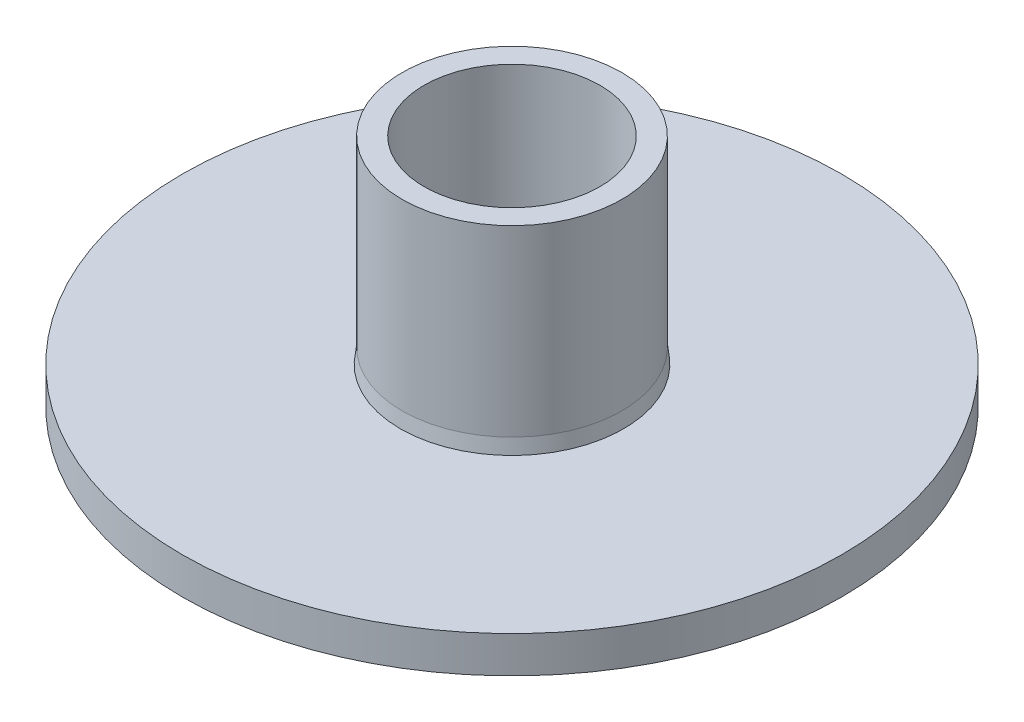
ISO-10303-21;
HEADER;
FILE_DESCRIPTION(('STEP AP214'),'2;1');
FILE_NAME('part.step','',(''),(''),'','','');
FILE_SCHEMA(('AUTOMOTIVE_DESIGN { 1 0 10303 214 1 1 1 1 }'));
ENDSEC;
DATA;
#1=APPLICATION_CONTEXT('core data for automotive mechanical design processes');
#2=APPLICATION_PROTOCOL_DEFINITION('international standard','automotive_design',2000,#1);
#3=PRODUCT_CONTEXT('',#1,'mechanical');
#4=PRODUCT('Part','Part','',(#3));
#5=PRODUCT_RELATED_PRODUCT_CATEGORY('part','',(#4));
#6=PRODUCT_DEFINITION_FORMATION('','',#4);
#7=PRODUCT_DEFINITION_CONTEXT('part definition',#1,'design');
#8=PRODUCT_DEFINITION('design','',#6,#7);
#9=PRODUCT_DEFINITION_SHAPE('','',#8);
#10=(LENGTH_UNIT() NAMED_UNIT(*) SI_UNIT(.MILLI.,.METRE.));
#11=(NAMED_UNIT(*) PLANE_ANGLE_UNIT() SI_UNIT($,.RADIAN.));
#12=(NAMED_UNIT(*) SI_UNIT($,.STERADIAN.) SOLID_ANGLE_UNIT());
#13=UNCERTAINTY_MEASURE_WITH_UNIT(LENGTH_MEASURE(1.E-05),#10,'distance_accuracy_value','');
#14=(GEOMETRIC_REPRESENTATION_CONTEXT(3) GLOBAL_UNCERTAINTY_ASSIGNED_CONTEXT((#13)) GLOBAL_UNIT_ASSIGNED_CONTEXT((#10,
#11,#12)) REPRESENTATION_CONTEXT('',''));
#15=CARTESIAN_POINT('',(0.,0.,0.));
#16=DIRECTION('',(0.,0.,1.));
#17=DIRECTION('',(1.,0.,0.));
#18=AXIS2_PLACEMENT_3D('',#15,#16,#17);
#19=CARTESIAN_POINT('',(0.,0.,0.));
#20=DIRECTION('',(0.,-1.,0.));
#21=DIRECTION('',(0.,0.,-1.));
#22=AXIS2_PLACEMENT_3D('',#19,#20,#21);
#23=CYLINDRICAL_SURFACE('',#22,45.);
#24=CARTESIAN_POINT('',(0.,4.99999999999999,0.));
#25=DIRECTION('',(0.,-1.,0.));
#26=DIRECTION('',(0.,0.,-1.));
#27=AXIS2_PLACEMENT_3D('',#24,#25,#26);
#28=CIRCLE('',#27,45.);
#29=CARTESIAN_POINT('',(0.,4.99999999999999,-45.));
#30=VERTEX_POINT('',#29);
#31=EDGE_CURVE('E116',#30,#30,#28,.T.);
#32=ORIENTED_EDGE('',*,*,#31,.T.);
#33=EDGE_LOOP('',(#32));
#34=FACE_BOUND('',#33,.T.);
#35=CARTESIAN_POINT('',(0.,0.,0.));
#36=DIRECTION('',(0.,-1.,0.));
#37=DIRECTION('',(0.,0.,-1.));
#38=AXIS2_PLACEMENT_3D('',#35,#36,#37);
#39=CIRCLE('',#38,45.);
#40=CARTESIAN_POINT('',(0.,0.,-45.));
#41=VERTEX_POINT('',#40);
#42=EDGE_CURVE('E77',#41,#41,#39,.T.);
#43=ORIENTED_EDGE('',*,*,#42,.F.);
#44=EDGE_LOOP('',(#43));
#45=FACE_BOUND('',#44,.T.);
#46=ADVANCED_FACE('F33',(#34,#45),#23,.T.);
#47=CARTESIAN_POINT('',(0.,0.,0.));
#48=DIRECTION('',(0.,-1.,0.));
#49=DIRECTION('',(0.,0.,-1.));
#50=AXIS2_PLACEMENT_3D('',#47,#48,#49);
#51=PLANE('',#50);
#52=ORIENTED_EDGE('',*,*,#42,.T.);
#53=EDGE_LOOP('',(#52));
#54=FACE_BOUND('',#53,.T.);
#55=CARTESIAN_POINT('',(0.,0.,0.));
#56=DIRECTION('',(0.,-1.,0.));
#57=DIRECTION('',(0.,0.,-1.));
#58=AXIS2_PLACEMENT_3D('',#55,#56,#57);
#59=CIRCLE('',#58,34.4);
#60=CARTESIAN_POINT('',(0.,0.,-34.4));
#61=VERTEX_POINT('',#60);
#62=EDGE_CURVE('E80',#61,#61,#59,.T.);
#63=ORIENTED_EDGE('',*,*,#62,.F.);
#64=EDGE_LOOP('',(#63));
#65=FACE_BOUND('',#64,.T.);
#66=ADVANCED_FACE('F139',(#54,#65),#51,.T.);
#67=CARTESIAN_POINT('',(0.,0.,0.));
#68=DIRECTION('',(0.,-1.,0.));
#69=DIRECTION('',(0.,0.,-1.));
#70=AXIS2_PLACEMENT_3D('',#67,#68,#69);
#71=CYLINDRICAL_SURFACE('',#70,34.4);
#72=CARTESIAN_POINT('',(0.,1.1,0.));
#73=DIRECTION('',(0.,1.,0.));
#74=DIRECTION('',(0.,0.,1.));
#75=AXIS2_PLACEMENT_3D('',#72,#73,#74);
#76=CIRCLE('',#75,34.4);
#77=CARTESIAN_POINT('',(0.,1.1,34.4));
#78=VERTEX_POINT('',#77);
#79=EDGE_CURVE('E40',#78,#78,#76,.T.);
#80=ORIENTED_EDGE('',*,*,#79,.T.);
#81=EDGE_LOOP('',(#80));
#82=FACE_BOUND('',#81,.T.);
#83=ORIENTED_EDGE('',*,*,#62,.T.);
#84=EDGE_LOOP('',(#83));
#85=FACE_BOUND('',#84,.T.);
#86=ADVANCED_FACE('F144',(#82,#85),#71,.F.);
#87=CARTESIAN_POINT('',(0.,1.3,0.));
#88=DIRECTION('',(0.,1.,0.));
#89=DIRECTION('',(0.,0.,1.));
#90=AXIS2_PLACEMENT_3D('',#87,#88,#89);
#91=PLANE('',#90);
#92=CARTESIAN_POINT('',(0.,1.3,0.));
#93=DIRECTION('',(0.,1.,0.));
#94=DIRECTION('',(0.,0.,1.));
#95=AXIS2_PLACEMENT_3D('',#92,#93,#94);
#96=CIRCLE('',#95,34.2);
#97=CARTESIAN_POINT('',(0.,1.3,34.2));
#98=VERTEX_POINT('',#97);
#99=EDGE_CURVE('E44',#98,#98,#96,.F.);
#100=ORIENTED_EDGE('',*,*,#99,.T.);
#101=EDGE_LOOP('',(#100));
#102=FACE_BOUND('',#101,.T.);
#103=CARTESIAN_POINT('',(0.,1.3,0.));
#104=DIRECTION('',(0.,1.,0.));
#105=DIRECTION('',(0.,0.,1.));
#106=AXIS2_PLACEMENT_3D('',#103,#104,#105);
#107=CIRCLE('',#106,32.2);
#108=CARTESIAN_POINT('',(0.,1.3,32.2));
#109=VERTEX_POINT('',#108);
#110=EDGE_CURVE('E48',#109,#109,#107,.T.);
#111=ORIENTED_EDGE('',*,*,#110,.T.);
#112=EDGE_LOOP('',(#111));
#113=FACE_BOUND('',#112,.T.);
#114=ADVANCED_FACE('F169',(#102,#113),#91,.F.);
#115=CARTESIAN_POINT('',(0.,0.,0.));
#116=DIRECTION('',(0.,-1.,0.));
#117=DIRECTION('',(0.,0.,-1.));
#118=AXIS2_PLACEMENT_3D('',#115,#116,#117);
#119=CYLINDRICAL_SURFACE('',#118,32.);
#120=CARTESIAN_POINT('',(0.,1.1,0.));
#121=DIRECTION('',(0.,1.,0.));
#122=DIRECTION('',(0.,0.,1.));
#123=AXIS2_PLACEMENT_3D('',#120,#121,#122);
#124=CIRCLE('',#123,32.);
#125=CARTESIAN_POINT('',(0.,1.1,32.));
#126=VERTEX_POINT('',#125);
#127=EDGE_CURVE('E10',#126,#126,#124,.F.);
#128=ORIENTED_EDGE('',*,*,#127,.T.);
#129=EDGE_LOOP('',(#128));
#130=FACE_BOUND('',#129,.T.);
#131=CARTESIAN_POINT('',(0.,0.,0.));
#132=DIRECTION('',(0.,-1.,0.));
#133=DIRECTION('',(0.,0.,-1.));
#134=AXIS2_PLACEMENT_3D('',#131,#132,#133);
#135=CIRCLE('',#134,32.);
#136=CARTESIAN_POINT('',(0.,0.,-32.));
#137=VERTEX_POINT('',#136);
#138=EDGE_CURVE('E83',#137,#137,#135,.T.);
#139=ORIENTED_EDGE('',*,*,#138,.F.);
#140=EDGE_LOOP('',(#139));
#141=FACE_BOUND('',#140,.T.);
#142=ADVANCED_FACE('F172',(#130,#141),#119,.T.);
#143=CARTESIAN_POINT('',(0.,0.,0.));
#144=DIRECTION('',(0.,-1.,0.));
#145=DIRECTION('',(0.,0.,-1.));
#146=AXIS2_PLACEMENT_3D('',#143,#144,#145);
#147=PLANE('',#146);
#148=ORIENTED_EDGE('',*,*,#138,.T.);
#149=EDGE_LOOP('',(#148));
#150=FACE_BOUND('',#149,.T.);
#151=CARTESIAN_POINT('',(0.,0.,0.));
#152=DIRECTION('',(0.,-1.,0.));
#153=DIRECTION('',(0.,0.,-1.));
#154=AXIS2_PLACEMENT_3D('',#151,#152,#153);
#155=CIRCLE('',#154,29.5);
#156=CARTESIAN_POINT('',(0.,0.,-29.5));
#157=VERTEX_POINT('',#156);
#158=EDGE_CURVE('E86',#157,#157,#155,.T.);
#159=ORIENTED_EDGE('',*,*,#158,.F.);
#160=EDGE_LOOP('',(#159));
#161=FACE_BOUND('',#160,.T.);
#162=ADVANCED_FACE('F180',(#150,#161),#147,.T.);
#163=CARTESIAN_POINT('',(0.,0.,0.));
#164=DIRECTION('',(0.,-1.,0.));
#165=DIRECTION('',(0.,0.,-1.));
#166=AXIS2_PLACEMENT_3D('',#163,#164,#165);
#167=CYLINDRICAL_SURFACE('',#166,29.5);
#168=CARTESIAN_POINT('',(0.,1.1,0.));
#169=DIRECTION('',(0.,1.,0.));
#170=DIRECTION('',(0.,0.,1.));
#171=AXIS2_PLACEMENT_3D('',#168,#169,#170);
#172=CIRCLE('',#171,29.5);
#173=CARTESIAN_POINT('',(0.,1.1,29.5));
#174=VERTEX_POINT('',#173);
#175=EDGE_CURVE('E56',#174,#174,#172,.T.);
#176=ORIENTED_EDGE('',*,*,#175,.T.);
#177=EDGE_LOOP('',(#176));
#178=FACE_BOUND('',#177,.T.);
#179=ORIENTED_EDGE('',*,*,#158,.T.);
#180=EDGE_LOOP('',(#179));
#181=FACE_BOUND('',#180,.T.);
#182=ADVANCED_FACE('F185',(#178,#181),#167,.F.);
#183=CARTESIAN_POINT('',(0.,1.3,0.));
#184=DIRECTION('',(0.,1.,0.));
#185=DIRECTION('',(0.,0.,1.));
#186=AXIS2_PLACEMENT_3D('',#183,#184,#185);
#187=PLANE('',#186);
#188=CARTESIAN_POINT('',(0.,1.3,0.));
#189=DIRECTION('',(0.,1.,0.));
#190=DIRECTION('',(0.,0.,1.));
#191=AXIS2_PLACEMENT_3D('',#188,#189,#190);
#192=CIRCLE('',#191,29.3);
#193=CARTESIAN_POINT('',(0.,1.3,29.3));
#194=VERTEX_POINT('',#193);
#195=EDGE_CURVE('E59',#194,#194,#192,.F.);
#196=ORIENTED_EDGE('',*,*,#195,.T.);
#197=EDGE_LOOP('',(#196));
#198=FACE_BOUND('',#197,.T.);
#199=CARTESIAN_POINT('',(0.,1.3,0.));
#200=DIRECTION('',(0.,1.,0.));
#201=DIRECTION('',(0.,0.,1.));
#202=AXIS2_PLACEMENT_3D('',#199,#200,#201);
#203=CIRCLE('',#202,27.3);
#204=CARTESIAN_POINT('',(0.,1.3,27.3));
#205=VERTEX_POINT('',#204);
#206=EDGE_CURVE('E62',#205,#205,#203,.T.);
#207=ORIENTED_EDGE('',*,*,#206,.T.);
#208=EDGE_LOOP('',(#207));
#209=FACE_BOUND('',#208,.T.);
#210=ADVANCED_FACE('F189',(#198,#209),#187,.F.);
#211=CARTESIAN_POINT('',(0.,0.,0.));
#212=DIRECTION('',(0.,-1.,0.));
#213=DIRECTION('',(0.,0.,-1.));
#214=AXIS2_PLACEMENT_3D('',#211,#212,#213);
#215=CYLINDRICAL_SURFACE('',#214,27.1);
#216=CARTESIAN_POINT('',(0.,1.1,0.));
#217=DIRECTION('',(0.,1.,0.));
#218=DIRECTION('',(0.,0.,1.));
#219=AXIS2_PLACEMENT_3D('',#216,#217,#218);
#220=CIRCLE('',#219,27.1);
#221=CARTESIAN_POINT('',(0.,1.1,27.1));
#222=VERTEX_POINT('',#221);
#223=EDGE_CURVE('E53',#222,#222,#220,.F.);
#224=ORIENTED_EDGE('',*,*,#223,.T.);
#225=EDGE_LOOP('',(#224));
#226=FACE_BOUND('',#225,.T.);
#227=CARTESIAN_POINT('',(0.,0.,0.));
#228=DIRECTION('',(0.,-1.,0.));
#229=DIRECTION('',(0.,0.,-1.));
#230=AXIS2_PLACEMENT_3D('',#227,#228,#229);
#231=CIRCLE('',#230,27.1);
#232=CARTESIAN_POINT('',(0.,0.,-27.1));
#233=VERTEX_POINT('',#232);
#234=EDGE_CURVE('E89',#233,#233,#231,.T.);
#235=ORIENTED_EDGE('',*,*,#234,.F.);
#236=EDGE_LOOP('',(#235));
#237=FACE_BOUND('',#236,.T.);
#238=ADVANCED_FACE('F193',(#226,#237),#215,.T.);
#239=CARTESIAN_POINT('',(0.,0.,0.));
#240=DIRECTION('',(0.,-1.,0.));
#241=DIRECTION('',(0.,0.,-1.));
#242=AXIS2_PLACEMENT_3D('',#239,#240,#241);
#243=PLANE('',#242);
#244=ORIENTED_EDGE('',*,*,#234,.T.);
#245=EDGE_LOOP('',(#244));
#246=FACE_BOUND('',#245,.T.);
#247=CARTESIAN_POINT('',(0.,0.,0.));
#248=DIRECTION('',(0.,-1.,0.));
#249=DIRECTION('',(0.,0.,-1.));
#250=AXIS2_PLACEMENT_3D('',#247,#248,#249);
#251=CIRCLE('',#250,18.4);
#252=CARTESIAN_POINT('',(0.,0.,-18.4));
#253=VERTEX_POINT('',#252);
#254=EDGE_CURVE('E92',#253,#253,#251,.T.);
#255=ORIENTED_EDGE('',*,*,#254,.F.);
#256=EDGE_LOOP('',(#255));
#257=FACE_BOUND('',#256,.T.);
#258=ADVANCED_FACE('F197',(#246,#257),#243,.T.);
#259=CARTESIAN_POINT('',(0.,0.,0.));
#260=DIRECTION('',(0.,-1.,0.));
#261=DIRECTION('',(0.,0.,-1.));
#262=AXIS2_PLACEMENT_3D('',#259,#260,#261);
#263=CYLINDRICAL_SURFACE('',#262,18.4);
#264=CARTESIAN_POINT('',(0.,1.1,0.));
#265=DIRECTION('',(0.,1.,0.));
#266=DIRECTION('',(0.,0.,1.));
#267=AXIS2_PLACEMENT_3D('',#264,#265,#266);
#268=CIRCLE('',#267,18.4);
#269=CARTESIAN_POINT('',(0.,1.1,18.4));
#270=VERTEX_POINT('',#269);
#271=EDGE_CURVE('E68',#270,#270,#268,.T.);
#272=ORIENTED_EDGE('',*,*,#271,.T.);
#273=EDGE_LOOP('',(#272));
#274=FACE_BOUND('',#273,.T.);
#275=ORIENTED_EDGE('',*,*,#254,.T.);
#276=EDGE_LOOP('',(#275));
#277=FACE_BOUND('',#276,.T.);
#278=ADVANCED_FACE('F201',(#274,#277),#263,.F.);
#279=CARTESIAN_POINT('',(0.,1.3,0.));
#280=DIRECTION('',(0.,1.,0.));
#281=DIRECTION('',(0.,0.,1.));
#282=AXIS2_PLACEMENT_3D('',#279,#280,#281);
#283=PLANE('',#282);
#284=CARTESIAN_POINT('',(0.,1.3,0.));
#285=DIRECTION('',(0.,1.,0.));
#286=DIRECTION('',(0.,0.,1.));
#287=AXIS2_PLACEMENT_3D('',#284,#285,#286);
#288=CIRCLE('',#287,18.2);
#289=CARTESIAN_POINT('',(0.,1.3,18.2));
#290=VERTEX_POINT('',#289);
#291=EDGE_CURVE('E71',#290,#290,#288,.F.);
#292=ORIENTED_EDGE('',*,*,#291,.T.);
#293=EDGE_LOOP('',(#292));
#294=FACE_BOUND('',#293,.T.);
#295=CARTESIAN_POINT('',(0.,1.3,0.));
#296=DIRECTION('',(0.,1.,0.));
#297=DIRECTION('',(0.,0.,1.));
#298=AXIS2_PLACEMENT_3D('',#295,#296,#297);
#299=CIRCLE('',#298,16.2);
#300=CARTESIAN_POINT('',(0.,1.3,16.2));
#301=VERTEX_POINT('',#300);
#302=EDGE_CURVE('E74',#301,#301,#299,.T.);
#303=ORIENTED_EDGE('',*,*,#302,.T.);
#304=EDGE_LOOP('',(#303));
#305=FACE_BOUND('',#304,.T.);
#306=ADVANCED_FACE('F205',(#294,#305),#283,.F.);
#307=CARTESIAN_POINT('',(0.,0.,0.));
#308=DIRECTION('',(0.,-1.,0.));
#309=DIRECTION('',(0.,0.,-1.));
#310=AXIS2_PLACEMENT_3D('',#307,#308,#309);
#311=CYLINDRICAL_SURFACE('',#310,16.);
#312=CARTESIAN_POINT('',(0.,1.1,0.));
#313=DIRECTION('',(0.,1.,0.));
#314=DIRECTION('',(0.,0.,1.));
#315=AXIS2_PLACEMENT_3D('',#312,#313,#314);
#316=CIRCLE('',#315,16.);
#317=CARTESIAN_POINT('',(0.,1.1,16.));
#318=VERTEX_POINT('',#317);
#319=EDGE_CURVE('E65',#318,#318,#316,.F.);
#320=ORIENTED_EDGE('',*,*,#319,.T.);
#321=EDGE_LOOP('',(#320));
#322=FACE_BOUND('',#321,.T.);
#323=CARTESIAN_POINT('',(0.,0.,0.));
#324=DIRECTION('',(0.,-1.,0.));
#325=DIRECTION('',(0.,0.,-1.));
#326=AXIS2_PLACEMENT_3D('',#323,#324,#325);
#327=CIRCLE('',#326,16.);
#328=CARTESIAN_POINT('',(0.,0.,-16.));
#329=VERTEX_POINT('',#328);
#330=EDGE_CURVE('E95',#329,#329,#327,.T.);
#331=ORIENTED_EDGE('',*,*,#330,.F.);
#332=EDGE_LOOP('',(#331));
#333=FACE_BOUND('',#332,.T.);
#334=ADVANCED_FACE('F209',(#322,#333),#311,.T.);
#335=CARTESIAN_POINT('',(0.,0.,0.));
#336=DIRECTION('',(0.,-1.,0.));
#337=DIRECTION('',(0.,0.,-1.));
#338=AXIS2_PLACEMENT_3D('',#335,#336,#337);
#339=PLANE('',#338);
#340=ORIENTED_EDGE('',*,*,#330,.T.);
#341=EDGE_LOOP('',(#340));
#342=FACE_BOUND('',#341,.T.);
#343=CARTESIAN_POINT('',(0.,0.,0.));
#344=DIRECTION('',(0.,-1.,0.));
#345=DIRECTION('',(0.,0.,-1.));
#346=AXIS2_PLACEMENT_3D('',#343,#344,#345);
#347=CIRCLE('',#346,13.);
#348=CARTESIAN_POINT('',(0.,0.,-13.));
#349=VERTEX_POINT('',#348);
#350=EDGE_CURVE('E98',#349,#349,#347,.T.);
#351=ORIENTED_EDGE('',*,*,#350,.F.);
#352=EDGE_LOOP('',(#351));
#353=FACE_BOUND('',#352,.T.);
#354=ADVANCED_FACE('F213',(#342,#353),#339,.T.);
#355=CARTESIAN_POINT('',(0.,8.5,0.));
#356=DIRECTION('',(0.,-1.,0.));
#357=DIRECTION('',(0.,0.,-1.));
#358=AXIS2_PLACEMENT_3D('',#355,#356,#357);
#359=CONICAL_SURFACE('',#358,12.,0.117108744566864);
#360=ORIENTED_EDGE('',*,*,#350,.T.);
#361=EDGE_LOOP('',(#360));
#362=FACE_BOUND('',#361,.T.);
#363=CARTESIAN_POINT('',(0.,8.5,0.));
#364=DIRECTION('',(0.,-1.,0.));
#365=DIRECTION('',(0.,0.,-1.));
#366=AXIS2_PLACEMENT_3D('',#363,#364,#365);
#367=CIRCLE('',#366,12.);
#368=CARTESIAN_POINT('',(0.,8.5,-12.));
#369=VERTEX_POINT('',#368);
#370=EDGE_CURVE('E101',#369,#369,#367,.T.);
#371=ORIENTED_EDGE('',*,*,#370,.F.);
#372=EDGE_LOOP('',(#371));
#373=FACE_BOUND('',#372,.T.);
#374=ADVANCED_FACE('F217',(#362,#373),#359,.F.);
#375=CARTESIAN_POINT('',(0.,0.,0.));
#376=DIRECTION('',(0.,-1.,0.));
#377=DIRECTION('',(0.,0.,-1.));
#378=AXIS2_PLACEMENT_3D('',#375,#376,#377);
#379=CYLINDRICAL_SURFACE('',#378,12.);
#380=ORIENTED_EDGE('',*,*,#370,.T.);
#381=EDGE_LOOP('',(#380));
#382=FACE_BOUND('',#381,.T.);
#383=CARTESIAN_POINT('',(0.,32.,0.));
#384=DIRECTION('',(0.,-1.,0.));
#385=DIRECTION('',(0.,0.,-1.));
#386=AXIS2_PLACEMENT_3D('',#383,#384,#385);
#387=CIRCLE('',#386,12.);
#388=CARTESIAN_POINT('',(0.,32.,-12.));
#389=VERTEX_POINT('',#388);
#390=EDGE_CURVE('E104',#389,#389,#387,.T.);
#391=ORIENTED_EDGE('',*,*,#390,.F.);
#392=EDGE_LOOP('',(#391));
#393=FACE_BOUND('',#392,.T.);
#394=ADVANCED_FACE('F221',(#382,#393),#379,.F.);
#395=CARTESIAN_POINT('',(0.,32.,0.));
#396=DIRECTION('',(0.,1.,0.));
#397=DIRECTION('',(0.,0.,1.));
#398=AXIS2_PLACEMENT_3D('',#395,#396,#397);
#399=PLANE('',#398);
#400=ORIENTED_EDGE('',*,*,#390,.T.);
#401=EDGE_LOOP('',(#400));
#402=FACE_BOUND('',#401,.T.);
#403=CARTESIAN_POINT('',(0.,32.,0.));
#404=DIRECTION('',(0.,-1.,0.));
#405=DIRECTION('',(0.,0.,-1.));
#406=AXIS2_PLACEMENT_3D('',#403,#404,#405);
#407=CIRCLE('',#406,15.);
#408=CARTESIAN_POINT('',(0.,32.,-15.));
#409=VERTEX_POINT('',#408);
#410=EDGE_CURVE('E107',#409,#409,#407,.T.);
#411=ORIENTED_EDGE('',*,*,#410,.F.);
#412=EDGE_LOOP('',(#411));
#413=FACE_BOUND('',#412,.T.);
#414=ADVANCED_FACE('F225',(#402,#413),#399,.T.);
#415=CARTESIAN_POINT('',(0.,0.,0.));
#416=DIRECTION('',(0.,-1.,0.));
#417=DIRECTION('',(0.,0.,-1.));
#418=AXIS2_PLACEMENT_3D('',#415,#416,#417);
#419=CYLINDRICAL_SURFACE('',#418,15.);
#420=ORIENTED_EDGE('',*,*,#410,.T.);
#421=EDGE_LOOP('',(#420));
#422=FACE_BOUND('',#421,.T.);
#423=CARTESIAN_POINT('',(0.,6.99999999999999,0.));
#424=DIRECTION('',(0.,-1.,0.));
#425=DIRECTION('',(0.,0.,-1.));
#426=AXIS2_PLACEMENT_3D('',#423,#424,#425);
#427=CIRCLE('',#426,15.);
#428=CARTESIAN_POINT('',(0.,6.99999999999999,-15.));
#429=VERTEX_POINT('',#428);
#430=EDGE_CURVE('E110',#429,#429,#427,.T.);
#431=ORIENTED_EDGE('',*,*,#430,.F.);
#432=EDGE_LOOP('',(#431));
#433=FACE_BOUND('',#432,.T.);
#434=ADVANCED_FACE('F135',(#422,#433),#419,.T.);
#435=CARTESIAN_POINT('',(0.,4.99999999999999,0.));
#436=DIRECTION('',(0.,-1.,0.));
#437=DIRECTION('',(0.,0.,-1.));
#438=AXIS2_PLACEMENT_3D('',#435,#436,#437);
#439=CONICAL_SURFACE('',#438,15.2352941176471,0.117108744566863);
#440=ORIENTED_EDGE('',*,*,#430,.T.);
#441=EDGE_LOOP('',(#440));
#442=FACE_BOUND('',#441,.T.);
#443=CARTESIAN_POINT('',(0.,4.99999999999999,0.));
#444=DIRECTION('',(0.,-1.,0.));
#445=DIRECTION('',(0.,0.,-1.));
#446=AXIS2_PLACEMENT_3D('',#443,#444,#445);
#447=CIRCLE('',#446,15.2352941176471);
#448=CARTESIAN_POINT('',(0.,4.99999999999999,-15.2352941176471));
#449=VERTEX_POINT('',#448);
#450=EDGE_CURVE('E113',#449,#449,#447,.T.);
#451=ORIENTED_EDGE('',*,*,#450,.F.);
#452=EDGE_LOOP('',(#451));
#453=FACE_BOUND('',#452,.T.);
#454=ADVANCED_FACE('F125',(#442,#453),#439,.T.);
#455=CARTESIAN_POINT('',(0.,4.99999999999999,0.));
#456=DIRECTION('',(0.,1.,0.));
#457=DIRECTION('',(0.,0.,1.));
#458=AXIS2_PLACEMENT_3D('',#455,#456,#457);
#459=PLANE('',#458);
#460=ORIENTED_EDGE('',*,*,#450,.T.);
#461=EDGE_LOOP('',(#460));
#462=FACE_BOUND('',#461,.T.);
#463=ORIENTED_EDGE('',*,*,#31,.F.);
#464=EDGE_LOOP('',(#463));
#465=FACE_BOUND('',#464,.T.);
#466=ADVANCED_FACE('F122',(#462,#465),#459,.T.);
#467=CARTESIAN_POINT('',(0.,1.1,0.));
#468=DIRECTION('',(0.,1.,0.));
#469=DIRECTION('',(0.,0.,1.));
#470=AXIS2_PLACEMENT_3D('',#467,#468,#469);
#471=TOROIDAL_SURFACE('',#470,18.2,0.2);
#472=ORIENTED_EDGE('',*,*,#271,.F.);
#473=EDGE_LOOP('',(#472));
#474=FACE_BOUND('',#473,.T.);
#475=ORIENTED_EDGE('',*,*,#291,.F.);
#476=EDGE_LOOP('',(#475));
#477=FACE_BOUND('',#476,.T.);
#478=ADVANCED_FACE('F124',(#474,#477),#471,.F.);
#479=CARTESIAN_POINT('',(0.,1.1,0.));
#480=DIRECTION('',(0.,1.,0.));
#481=DIRECTION('',(0.,0.,1.));
#482=AXIS2_PLACEMENT_3D('',#479,#480,#481);
#483=TOROIDAL_SURFACE('',#482,16.2,0.2);
#484=ORIENTED_EDGE('',*,*,#302,.F.);
#485=EDGE_LOOP('',(#484));
#486=FACE_BOUND('',#485,.T.);
#487=ORIENTED_EDGE('',*,*,#319,.F.);
#488=EDGE_LOOP('',(#487));
#489=FACE_BOUND('',#488,.T.);
#490=ADVANCED_FACE('F132',(#486,#489),#483,.F.);
#491=CARTESIAN_POINT('',(0.,1.1,0.));
#492=DIRECTION('',(0.,1.,0.));
#493=DIRECTION('',(0.,0.,1.));
#494=AXIS2_PLACEMENT_3D('',#491,#492,#493);
#495=TOROIDAL_SURFACE('',#494,29.3,0.2);
#496=ORIENTED_EDGE('',*,*,#175,.F.);
#497=EDGE_LOOP('',(#496));
#498=FACE_BOUND('',#497,.T.);
#499=ORIENTED_EDGE('',*,*,#195,.F.);
#500=EDGE_LOOP('',(#499));
#501=FACE_BOUND('',#500,.T.);
#502=ADVANCED_FACE('F151',(#498,#501),#495,.F.);
#503=CARTESIAN_POINT('',(0.,1.1,0.));
#504=DIRECTION('',(0.,1.,0.));
#505=DIRECTION('',(0.,0.,1.));
#506=AXIS2_PLACEMENT_3D('',#503,#504,#505);
#507=TOROIDAL_SURFACE('',#506,27.3,0.2);
#508=ORIENTED_EDGE('',*,*,#206,.F.);
#509=EDGE_LOOP('',(#508));
#510=FACE_BOUND('',#509,.T.);
#511=ORIENTED_EDGE('',*,*,#223,.F.);
#512=EDGE_LOOP('',(#511));
#513=FACE_BOUND('',#512,.T.);
#514=ADVANCED_FACE('F155',(#510,#513),#507,.F.);
#515=CARTESIAN_POINT('',(0.,1.1,0.));
#516=DIRECTION('',(0.,1.,0.));
#517=DIRECTION('',(0.,0.,1.));
#518=AXIS2_PLACEMENT_3D('',#515,#516,#517);
#519=TOROIDAL_SURFACE('',#518,34.2,0.2);
#520=ORIENTED_EDGE('',*,*,#79,.F.);
#521=EDGE_LOOP('',(#520));
#522=FACE_BOUND('',#521,.T.);
#523=ORIENTED_EDGE('',*,*,#99,.F.);
#524=EDGE_LOOP('',(#523));
#525=FACE_BOUND('',#524,.T.);
#526=ADVANCED_FACE('F158',(#522,#525),#519,.F.);
#527=CARTESIAN_POINT('',(0.,1.1,0.));
#528=DIRECTION('',(0.,1.,0.));
#529=DIRECTION('',(0.,0.,1.));
#530=AXIS2_PLACEMENT_3D('',#527,#528,#529);
#531=TOROIDAL_SURFACE('',#530,32.2,0.2);
#532=ORIENTED_EDGE('',*,*,#110,.F.);
#533=EDGE_LOOP('',(#532));
#534=FACE_BOUND('',#533,.T.);
#535=ORIENTED_EDGE('',*,*,#127,.F.);
#536=EDGE_LOOP('',(#535));
#537=FACE_BOUND('',#536,.T.);
#538=ADVANCED_FACE('F35',(#534,#537),#531,.F.);
#539=CLOSED_SHELL('',(#46,#66,#86,#114,#142,#162,#182,#210,#238,#258,#278,#306,#334,#354,#374,
#394,#414,#434,#454,#466,#478,#490,#502,#514,#526,#538));
#540=MANIFOLD_SOLID_BREP('B2',#539);
#541=ADVANCED_BREP_SHAPE_REPRESENTATION('',(#18,#540),#14);
#542=SHAPE_DEFINITION_REPRESENTATION(#9,#541);
ENDSEC;
END-ISO-10303-21;
